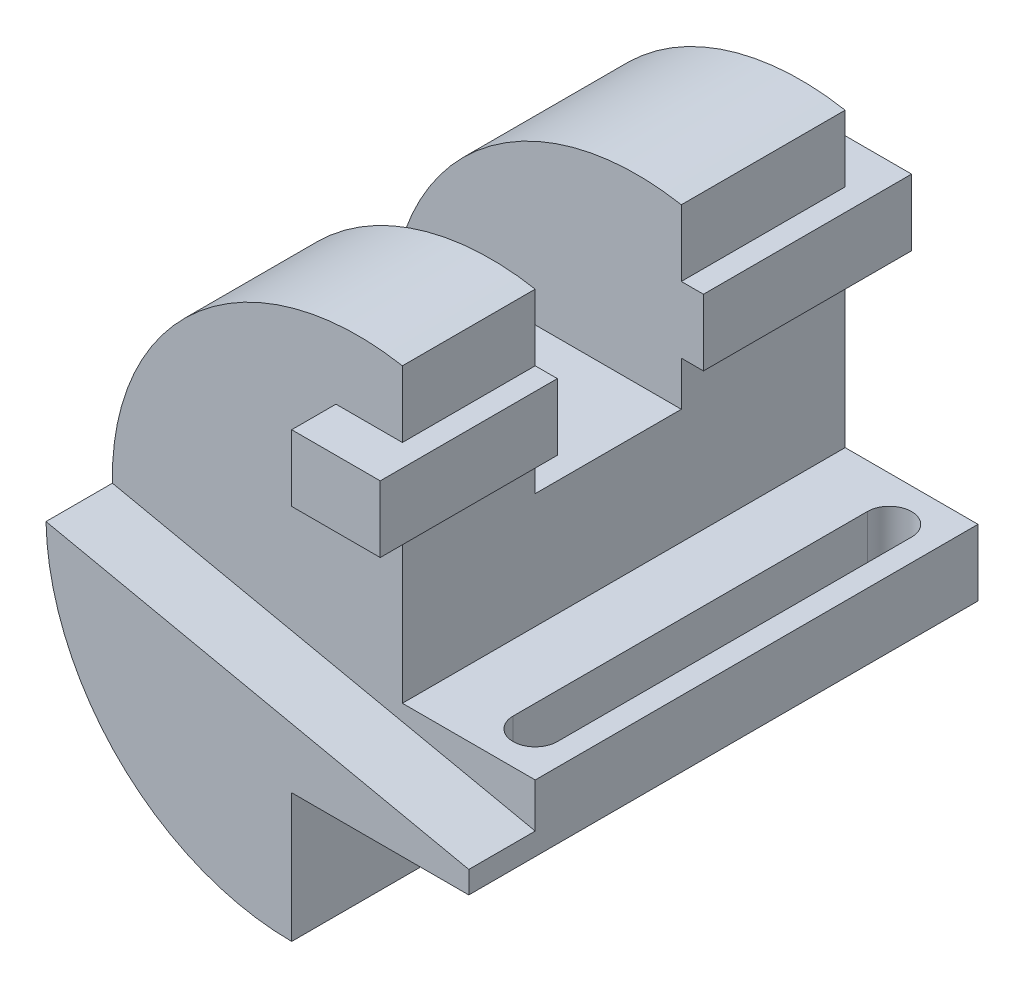
ISO-10303-21;
HEADER;
FILE_DESCRIPTION(('STEP AP214'),'2;1');
FILE_NAME('part.step','',(''),(''),'','','');
FILE_SCHEMA(('AUTOMOTIVE_DESIGN { 1 0 10303 214 1 1 1 1 }'));
ENDSEC;
DATA;
#1=APPLICATION_CONTEXT('core data for automotive mechanical design processes');
#2=APPLICATION_PROTOCOL_DEFINITION('international standard','automotive_design',2000,#1);
#3=PRODUCT_CONTEXT('',#1,'mechanical');
#4=PRODUCT('Part','Part','',(#3));
#5=PRODUCT_RELATED_PRODUCT_CATEGORY('part','',(#4));
#6=PRODUCT_DEFINITION_FORMATION('','',#4);
#7=PRODUCT_DEFINITION_CONTEXT('part definition',#1,'design');
#8=PRODUCT_DEFINITION('design','',#6,#7);
#9=PRODUCT_DEFINITION_SHAPE('','',#8);
#10=(LENGTH_UNIT() NAMED_UNIT(*) SI_UNIT(.MILLI.,.METRE.));
#11=(NAMED_UNIT(*) PLANE_ANGLE_UNIT() SI_UNIT($,.RADIAN.));
#12=(NAMED_UNIT(*) SI_UNIT($,.STERADIAN.) SOLID_ANGLE_UNIT());
#13=UNCERTAINTY_MEASURE_WITH_UNIT(LENGTH_MEASURE(1.E-05),#10,'distance_accuracy_value','');
#14=(GEOMETRIC_REPRESENTATION_CONTEXT(3) GLOBAL_UNCERTAINTY_ASSIGNED_CONTEXT((#13)) GLOBAL_UNIT_ASSIGNED_CONTEXT((#10,
#11,#12)) REPRESENTATION_CONTEXT('',''));
#15=CARTESIAN_POINT('',(0.,0.,0.));
#16=DIRECTION('',(0.,0.,1.));
#17=DIRECTION('',(1.,0.,0.));
#18=AXIS2_PLACEMENT_3D('',#15,#16,#17);
#19=CARTESIAN_POINT('',(-30.,15.,115.));
#20=DIRECTION('',(-1.,0.,0.));
#21=DIRECTION('',(0.,0.,1.));
#22=AXIS2_PLACEMENT_3D('',#19,#20,#21);
#23=PLANE('',#22);
#24=DIRECTION('',(0.,0.,1.));
#25=VECTOR('',#24,1.);
#26=CARTESIAN_POINT('',(-30.,66.,115.));
#27=LINE('',#26,#25);
#28=CARTESIAN_POINT('',(-30.,66.,70.));
#29=VERTEX_POINT('',#28);
#30=CARTESIAN_POINT('',(-30.,66.,100.));
#31=VERTEX_POINT('',#30);
#32=EDGE_CURVE('E322',#29,#31,#27,.T.);
#33=ORIENTED_EDGE('',*,*,#32,.F.);
#34=DIRECTION('',(0.,1.,0.));
#35=VECTOR('',#34,1.);
#36=CARTESIAN_POINT('',(-30.,15.,70.));
#37=LINE('',#36,#35);
#38=CARTESIAN_POINT('',(-30.,81.,70.));
#39=VERTEX_POINT('',#38);
#40=EDGE_CURVE('E271',#29,#39,#37,.T.);
#41=ORIENTED_EDGE('',*,*,#40,.T.);
#42=DIRECTION('',(0.,0.,-1.));
#43=VECTOR('',#42,1.);
#44=CARTESIAN_POINT('',(-30.,81.,115.));
#45=LINE('',#44,#43);
#46=CARTESIAN_POINT('',(-30.,81.,100.));
#47=VERTEX_POINT('',#46);
#48=EDGE_CURVE('E394',#47,#39,#45,.T.);
#49=ORIENTED_EDGE('',*,*,#48,.F.);
#50=DIRECTION('',(0.,1.,0.));
#51=VECTOR('',#50,1.);
#52=CARTESIAN_POINT('',(-30.,15.,100.));
#53=LINE('',#52,#51);
#54=EDGE_CURVE('E344',#31,#47,#53,.T.);
#55=ORIENTED_EDGE('',*,*,#54,.F.);
#56=EDGE_LOOP('',(#33,#41,#49,#55));
#57=FACE_BOUND('',#56,.T.);
#58=ADVANCED_FACE('F45',(#57),#23,.F.);
#59=CARTESIAN_POINT('',(-25.,66.,-10.));
#60=DIRECTION('',(-1.,0.,0.));
#61=DIRECTION('',(0.,0.,1.));
#62=AXIS2_PLACEMENT_3D('',#59,#60,#61);
#63=PLANE('',#62);
#64=DIRECTION('',(0.,0.,1.));
#65=VECTOR('',#64,1.);
#66=CARTESIAN_POINT('',(-25.,51.,-10.));
#67=LINE('',#66,#65);
#68=CARTESIAN_POINT('',(-25.,51.,70.));
#69=VERTEX_POINT('',#68);
#70=CARTESIAN_POINT('',(-25.,51.,110.));
#71=VERTEX_POINT('',#70);
#72=EDGE_CURVE('E318',#69,#71,#67,.T.);
#73=ORIENTED_EDGE('',*,*,#72,.F.);
#74=DIRECTION('',(0.,1.,0.));
#75=VECTOR('',#74,1.);
#76=CARTESIAN_POINT('',(-25.,66.,70.));
#77=LINE('',#76,#75);
#78=CARTESIAN_POINT('',(-25.,66.,70.));
#79=VERTEX_POINT('',#78);
#80=EDGE_CURVE('E266',#69,#79,#77,.T.);
#81=ORIENTED_EDGE('',*,*,#80,.T.);
#82=DIRECTION('',(0.,0.,1.));
#83=VECTOR('',#82,1.);
#84=CARTESIAN_POINT('',(-25.,66.,-10.));
#85=LINE('',#84,#83);
#86=CARTESIAN_POINT('',(-25.,66.,110.));
#87=VERTEX_POINT('',#86);
#88=EDGE_CURVE('E306',#79,#87,#85,.T.);
#89=ORIENTED_EDGE('',*,*,#88,.T.);
#90=DIRECTION('',(0.,1.,0.));
#91=VECTOR('',#90,1.);
#92=CARTESIAN_POINT('',(-25.,66.,110.));
#93=LINE('',#92,#91);
#94=EDGE_CURVE('E291',#71,#87,#93,.T.);
#95=ORIENTED_EDGE('',*,*,#94,.F.);
#96=EDGE_LOOP('',(#73,#81,#89,#95));
#97=FACE_BOUND('',#96,.T.);
#98=ADVANCED_FACE('F447',(#97),#63,.F.);
#99=CARTESIAN_POINT('',(-25.,51.,-10.));
#100=DIRECTION('',(0.,1.,0.));
#101=DIRECTION('',(0.,0.,1.));
#102=AXIS2_PLACEMENT_3D('',#99,#100,#101);
#103=PLANE('',#102);
#104=DIRECTION('',(0.,0.,-1.));
#105=VECTOR('',#104,1.);
#106=CARTESIAN_POINT('',(-30.,51.,115.));
#107=LINE('',#106,#105);
#108=CARTESIAN_POINT('',(-30.,51.,100.));
#109=VERTEX_POINT('',#108);
#110=CARTESIAN_POINT('',(-30.,51.,70.));
#111=VERTEX_POINT('',#110);
#112=EDGE_CURVE('E333',#109,#111,#107,.T.);
#113=ORIENTED_EDGE('',*,*,#112,.T.);
#114=DIRECTION('',(1.,0.,0.));
#115=VECTOR('',#114,1.);
#116=CARTESIAN_POINT('',(-25.,51.,70.));
#117=LINE('',#116,#115);
#118=EDGE_CURVE('E274',#111,#69,#117,.T.);
#119=ORIENTED_EDGE('',*,*,#118,.T.);
#120=ORIENTED_EDGE('',*,*,#72,.T.);
#121=DIRECTION('',(1.,0.,0.));
#122=VECTOR('',#121,1.);
#123=CARTESIAN_POINT('',(-25.,51.,110.));
#124=LINE('',#123,#122);
#125=CARTESIAN_POINT('',(-45.,51.,110.));
#126=VERTEX_POINT('',#125);
#127=EDGE_CURVE('E294',#126,#71,#124,.T.);
#128=ORIENTED_EDGE('',*,*,#127,.F.);
#129=DIRECTION('',(0.,0.,1.));
#130=VECTOR('',#129,1.);
#131=CARTESIAN_POINT('',(-45.,51.,-10.));
#132=LINE('',#131,#130);
#133=CARTESIAN_POINT('',(-45.,51.,100.));
#134=VERTEX_POINT('',#133);
#135=EDGE_CURVE('E314',#134,#126,#132,.T.);
#136=ORIENTED_EDGE('',*,*,#135,.F.);
#137=DIRECTION('',(-1.,0.,0.));
#138=VECTOR('',#137,1.);
#139=CARTESIAN_POINT('',(-40.,51.,100.));
#140=LINE('',#139,#138);
#141=EDGE_CURVE('E407',#109,#134,#140,.T.);
#142=ORIENTED_EDGE('',*,*,#141,.F.);
#143=EDGE_LOOP('',(#113,#119,#120,#128,#136,#142));
#144=FACE_BOUND('',#143,.T.);
#145=ADVANCED_FACE('F456',(#144),#103,.F.);
#146=CARTESIAN_POINT('',(-25.,66.,-10.));
#147=DIRECTION('',(0.,-1.,0.));
#148=DIRECTION('',(0.,0.,-1.));
#149=AXIS2_PLACEMENT_3D('',#146,#147,#148);
#150=PLANE('',#149);
#151=ORIENTED_EDGE('',*,*,#88,.F.);
#152=DIRECTION('',(-1.,0.,0.));
#153=VECTOR('',#152,1.);
#154=CARTESIAN_POINT('',(-25.,66.,70.));
#155=LINE('',#154,#153);
#156=EDGE_CURVE('E413',#79,#29,#155,.T.);
#157=ORIENTED_EDGE('',*,*,#156,.T.);
#158=ORIENTED_EDGE('',*,*,#32,.T.);
#159=DIRECTION('',(1.,0.,0.));
#160=VECTOR('',#159,1.);
#161=CARTESIAN_POINT('',(-40.,66.,100.));
#162=LINE('',#161,#160);
#163=CARTESIAN_POINT('',(-45.,66.,100.));
#164=VERTEX_POINT('',#163);
#165=EDGE_CURVE('E401',#164,#31,#162,.T.);
#166=ORIENTED_EDGE('',*,*,#165,.F.);
#167=DIRECTION('',(0.,0.,1.));
#168=VECTOR('',#167,1.);
#169=CARTESIAN_POINT('',(-45.,66.,-10.));
#170=LINE('',#169,#168);
#171=CARTESIAN_POINT('',(-45.,66.,110.));
#172=VERTEX_POINT('',#171);
#173=EDGE_CURVE('E310',#164,#172,#170,.T.);
#174=ORIENTED_EDGE('',*,*,#173,.T.);
#175=DIRECTION('',(-1.,0.,0.));
#176=VECTOR('',#175,1.);
#177=CARTESIAN_POINT('',(-25.,66.,110.));
#178=LINE('',#177,#176);
#179=EDGE_CURVE('E288',#87,#172,#178,.T.);
#180=ORIENTED_EDGE('',*,*,#179,.F.);
#181=EDGE_LOOP('',(#151,#157,#158,#166,#174,#180));
#182=FACE_BOUND('',#181,.T.);
#183=ADVANCED_FACE('F466',(#182),#150,.F.);
#184=DIRECTION('',(0.,0.,1.));
#185=VECTOR('',#184,1.);
#186=CARTESIAN_POINT('',(-30.,41.,115.));
#187=LINE('',#186,#185);
#188=CARTESIAN_POINT('',(-30.,41.,37.));
#189=VERTEX_POINT('',#188);
#190=CARTESIAN_POINT('',(-30.,41.,70.));
#191=VERTEX_POINT('',#190);
#192=EDGE_CURVE('E282',#189,#191,#187,.T.);
#193=ORIENTED_EDGE('',*,*,#192,.T.);
#194=DIRECTION('',(0.,1.,0.));
#195=VECTOR('',#194,1.);
#196=CARTESIAN_POINT('',(-30.,15.,70.));
#197=LINE('',#196,#195);
#198=EDGE_CURVE('E279',#191,#111,#197,.T.);
#199=ORIENTED_EDGE('',*,*,#198,.T.);
#200=ORIENTED_EDGE('',*,*,#112,.F.);
#201=CARTESIAN_POINT('',(-30.,15.,100.));
#202=VERTEX_POINT('',#201);
#203=EDGE_CURVE('E345',#202,#109,#53,.T.);
#204=ORIENTED_EDGE('',*,*,#203,.F.);
#205=DIRECTION('',(0.,0.,-1.));
#206=VECTOR('',#205,1.);
#207=CARTESIAN_POINT('',(-30.,15.,115.));
#208=LINE('',#207,#206);
#209=CARTESIAN_POINT('',(-30.,15.,0.));
#210=VERTEX_POINT('',#209);
#211=EDGE_CURVE('E397',#202,#210,#208,.T.);
#212=ORIENTED_EDGE('',*,*,#211,.T.);
#213=DIRECTION('',(0.,1.,0.));
#214=VECTOR('',#213,1.);
#215=CARTESIAN_POINT('',(-30.,15.,0.));
#216=LINE('',#215,#214);
#217=CARTESIAN_POINT('',(-30.,51.,0.));
#218=VERTEX_POINT('',#217);
#219=EDGE_CURVE('E377',#210,#218,#216,.T.);
#220=ORIENTED_EDGE('',*,*,#219,.T.);
#221=CARTESIAN_POINT('',(-30.,51.,37.));
#222=VERTEX_POINT('',#221);
#223=EDGE_CURVE('E332',#222,#218,#107,.T.);
#224=ORIENTED_EDGE('',*,*,#223,.F.);
#225=DIRECTION('',(0.,-1.,0.));
#226=VECTOR('',#225,1.);
#227=CARTESIAN_POINT('',(-30.,15.,37.));
#228=LINE('',#227,#226);
#229=EDGE_CURVE('E263',#222,#189,#228,.T.);
#230=ORIENTED_EDGE('',*,*,#229,.T.);
#231=EDGE_LOOP('',(#193,#199,#200,#204,#212,#220,#224,#230));
#232=FACE_BOUND('',#231,.T.);
#233=ADVANCED_FACE('F451',(#232),#23,.F.);
#234=CARTESIAN_POINT('',(-30.,81.,37.));
#235=VERTEX_POINT('',#234);
#236=CARTESIAN_POINT('',(-30.,81.,0.));
#237=VERTEX_POINT('',#236);
#238=EDGE_CURVE('E393',#235,#237,#45,.T.);
#239=ORIENTED_EDGE('',*,*,#238,.F.);
#240=DIRECTION('',(0.,-1.,0.));
#241=VECTOR('',#240,1.);
#242=CARTESIAN_POINT('',(-30.,15.,37.));
#243=LINE('',#242,#241);
#244=CARTESIAN_POINT('',(-30.,66.,37.));
#245=VERTEX_POINT('',#244);
#246=EDGE_CURVE('E257',#235,#245,#243,.T.);
#247=ORIENTED_EDGE('',*,*,#246,.T.);
#248=CARTESIAN_POINT('',(-30.,66.,0.));
#249=VERTEX_POINT('',#248);
#250=EDGE_CURVE('E323',#249,#245,#27,.T.);
#251=ORIENTED_EDGE('',*,*,#250,.F.);
#252=EDGE_CURVE('E376',#249,#237,#216,.T.);
#253=ORIENTED_EDGE('',*,*,#252,.T.);
#254=EDGE_LOOP('',(#239,#247,#251,#253));
#255=FACE_BOUND('',#254,.T.);
#256=ADVANCED_FACE('F450',(#255),#23,.F.);
#257=CARTESIAN_POINT('',(-40.,26.4083339693685,0.));
#258=DIRECTION('',(0.,0.,-1.));
#259=DIRECTION('',(-1.,0.,0.));
#260=AXIS2_PLACEMENT_3D('',#257,#258,#259);
#261=PLANE('',#260);
#262=DIRECTION('',(0.,-1.,0.));
#263=VECTOR('',#262,1.);
#264=CARTESIAN_POINT('',(-45.,26.4083339693685,0.));
#265=LINE('',#264,#263);
#266=CARTESIAN_POINT('',(-45.,66.,0.));
#267=VERTEX_POINT('',#266);
#268=CARTESIAN_POINT('',(-45.,51.,0.));
#269=VERTEX_POINT('',#268);
#270=EDGE_CURVE('E329',#267,#269,#265,.T.);
#271=ORIENTED_EDGE('',*,*,#270,.T.);
#272=DIRECTION('',(1.,0.,0.));
#273=VECTOR('',#272,1.);
#274=CARTESIAN_POINT('',(-40.,51.,0.));
#275=LINE('',#274,#273);
#276=EDGE_CURVE('E336',#269,#218,#275,.T.);
#277=ORIENTED_EDGE('',*,*,#276,.T.);
#278=ORIENTED_EDGE('',*,*,#219,.F.);
#279=DIRECTION('',(-1.,0.,0.));
#280=VECTOR('',#279,1.);
#281=CARTESIAN_POINT('',(0.,15.,0.));
#282=LINE('',#281,#280);
#283=CARTESIAN_POINT('',(0.,15.,0.));
#284=VERTEX_POINT('',#283);
#285=EDGE_CURVE('E373',#284,#210,#282,.T.);
#286=ORIENTED_EDGE('',*,*,#285,.F.);
#287=DIRECTION('',(0.,1.,0.));
#288=VECTOR('',#287,1.);
#289=CARTESIAN_POINT('',(0.,0.,0.));
#290=LINE('',#289,#288);
#291=CARTESIAN_POINT('',(0.,0.,0.));
#292=VERTEX_POINT('',#291);
#293=EDGE_CURVE('E358',#292,#284,#290,.T.);
#294=ORIENTED_EDGE('',*,*,#293,.F.);
#295=DIRECTION('',(1.,0.,0.));
#296=VECTOR('',#295,1.);
#297=CARTESIAN_POINT('',(0.,0.,0.));
#298=LINE('',#297,#296);
#299=CARTESIAN_POINT('',(-40.,0.,0.));
#300=VERTEX_POINT('',#299);
#301=EDGE_CURVE('E364',#300,#292,#298,.T.);
#302=ORIENTED_EDGE('',*,*,#301,.F.);
#303=DIRECTION('',(0.,1.,0.));
#304=VECTOR('',#303,1.);
#305=CARTESIAN_POINT('',(-40.,0.,0.));
#306=LINE('',#305,#304);
#307=CARTESIAN_POINT('',(-40.,-29.0916660306315,0.));
#308=VERTEX_POINT('',#307);
#309=EDGE_CURVE('E382',#308,#300,#306,.T.);
#310=ORIENTED_EDGE('',*,*,#309,.F.);
#311=CARTESIAN_POINT('',(-40.,26.4083339693685,0.));
#312=DIRECTION('',(0.,0.,1.));
#313=DIRECTION('',(-1.,0.,0.));
#314=AXIS2_PLACEMENT_3D('',#311,#312,#313);
#315=CIRCLE('',#314,55.5);
#316=EDGE_CURVE('E380',#237,#308,#315,.T.);
#317=ORIENTED_EDGE('',*,*,#316,.F.);
#318=ORIENTED_EDGE('',*,*,#252,.F.);
#319=DIRECTION('',(-1.,0.,0.));
#320=VECTOR('',#319,1.);
#321=CARTESIAN_POINT('',(-40.,66.,0.));
#322=LINE('',#321,#320);
#323=EDGE_CURVE('E326',#249,#267,#322,.T.);
#324=ORIENTED_EDGE('',*,*,#323,.T.);
#325=EDGE_LOOP('',(#271,#277,#278,#286,#294,#302,#310,#317,#318,#324));
#326=FACE_BOUND('',#325,.T.);
#327=ADVANCED_FACE('F463',(#326),#261,.T.);
#328=CARTESIAN_POINT('',(-40.,26.4083339693685,100.));
#329=DIRECTION('',(0.,0.,1.));
#330=DIRECTION('',(1.,0.,0.));
#331=AXIS2_PLACEMENT_3D('',#328,#329,#330);
#332=PLANE('',#331);
#333=ORIENTED_EDGE('',*,*,#203,.T.);
#334=ORIENTED_EDGE('',*,*,#141,.T.);
#335=DIRECTION('',(0.,1.,0.));
#336=VECTOR('',#335,1.);
#337=CARTESIAN_POINT('',(-45.,26.4083339693685,100.));
#338=LINE('',#337,#336);
#339=EDGE_CURVE('E404',#134,#164,#338,.T.);
#340=ORIENTED_EDGE('',*,*,#339,.T.);
#341=ORIENTED_EDGE('',*,*,#165,.T.);
#342=ORIENTED_EDGE('',*,*,#54,.T.);
#343=CARTESIAN_POINT('',(-40.,26.4083339693685,100.));
#344=DIRECTION('',(0.,0.,1.));
#345=DIRECTION('',(1.,0.,0.));
#346=AXIS2_PLACEMENT_3D('',#343,#344,#345);
#347=CIRCLE('',#346,55.5);
#348=CARTESIAN_POINT('',(-95.4888678913132,25.2967854367402,100.));
#349=VERTEX_POINT('',#348);
#350=EDGE_CURVE('E348',#47,#349,#347,.T.);
#351=ORIENTED_EDGE('',*,*,#350,.T.);
#352=DIRECTION('',(0.978147600733806,-0.207911690817756,0.));
#353=VECTOR('',#352,1.);
#354=CARTESIAN_POINT('',(0.,5.,100.));
#355=LINE('',#354,#353);
#356=CARTESIAN_POINT('',(0.,5.,100.));
#357=VERTEX_POINT('',#356);
#358=EDGE_CURVE('E350',#349,#357,#355,.T.);
#359=ORIENTED_EDGE('',*,*,#358,.T.);
#360=DIRECTION('',(0.,1.,0.));
#361=VECTOR('',#360,1.);
#362=CARTESIAN_POINT('',(0.,5.,100.));
#363=LINE('',#362,#361);
#364=CARTESIAN_POINT('',(0.,15.,100.));
#365=VERTEX_POINT('',#364);
#366=EDGE_CURVE('E340',#357,#365,#363,.T.);
#367=ORIENTED_EDGE('',*,*,#366,.T.);
#368=DIRECTION('',(-1.,0.,0.));
#369=VECTOR('',#368,1.);
#370=CARTESIAN_POINT('',(0.,15.,100.));
#371=LINE('',#370,#369);
#372=EDGE_CURVE('E342',#365,#202,#371,.T.);
#373=ORIENTED_EDGE('',*,*,#372,.T.);
#374=EDGE_LOOP('',(#333,#334,#340,#341,#342,#351,#359,#367,#373));
#375=FACE_BOUND('',#374,.T.);
#376=ADVANCED_FACE('F501',(#375),#332,.T.);
#377=CARTESIAN_POINT('',(0.,15.,115.));
#378=DIRECTION('',(0.,-1.,0.));
#379=DIRECTION('',(1.,0.,0.));
#380=AXIS2_PLACEMENT_3D('',#377,#378,#379);
#381=PLANE('',#380);
#382=DIRECTION('',(0.,0.,-1.));
#383=VECTOR('',#382,1.);
#384=CARTESIAN_POINT('',(-15.,15.,115.));
#385=LINE('',#384,#383);
#386=CARTESIAN_POINT('',(-15.,15.,90.));
#387=VERTEX_POINT('',#386);
#388=CARTESIAN_POINT('',(-15.,15.,10.));
#389=VERTEX_POINT('',#388);
#390=EDGE_CURVE('E221',#387,#389,#385,.T.);
#391=ORIENTED_EDGE('',*,*,#390,.T.);
#392=CARTESIAN_POINT('',(-10.,15.,10.));
#393=DIRECTION('',(0.,-1.,0.));
#394=DIRECTION('',(1.,0.,0.));
#395=AXIS2_PLACEMENT_3D('',#392,#393,#394);
#396=CIRCLE('',#395,5.);
#397=CARTESIAN_POINT('',(-5.,15.,10.));
#398=VERTEX_POINT('',#397);
#399=EDGE_CURVE('E243',#389,#398,#396,.T.);
#400=ORIENTED_EDGE('',*,*,#399,.T.);
#401=DIRECTION('',(0.,0.,1.));
#402=VECTOR('',#401,1.);
#403=CARTESIAN_POINT('',(-5.,15.,115.));
#404=LINE('',#403,#402);
#405=CARTESIAN_POINT('',(-5.,15.,90.));
#406=VERTEX_POINT('',#405);
#407=EDGE_CURVE('E241',#398,#406,#404,.T.);
#408=ORIENTED_EDGE('',*,*,#407,.T.);
#409=CARTESIAN_POINT('',(-10.,15.,90.));
#410=DIRECTION('',(0.,-1.,0.));
#411=DIRECTION('',(1.,0.,0.));
#412=AXIS2_PLACEMENT_3D('',#409,#410,#411);
#413=CIRCLE('',#412,5.);
#414=EDGE_CURVE('E226',#406,#387,#413,.T.);
#415=ORIENTED_EDGE('',*,*,#414,.T.);
#416=EDGE_LOOP('',(#391,#400,#408,#415));
#417=FACE_BOUND('',#416,.T.);
#418=ORIENTED_EDGE('',*,*,#372,.F.);
#419=DIRECTION('',(0.,0.,-1.));
#420=VECTOR('',#419,1.);
#421=CARTESIAN_POINT('',(0.,15.,115.));
#422=LINE('',#421,#420);
#423=EDGE_CURVE('E399',#365,#284,#422,.T.);
#424=ORIENTED_EDGE('',*,*,#423,.T.);
#425=ORIENTED_EDGE('',*,*,#285,.T.);
#426=ORIENTED_EDGE('',*,*,#211,.F.);
#427=EDGE_LOOP('',(#418,#424,#425,#426));
#428=FACE_BOUND('',#427,.T.);
#429=ADVANCED_FACE('F239',(#417,#428),#381,.F.);
#430=CARTESIAN_POINT('',(0.,0.,115.));
#431=DIRECTION('',(-1.,0.,0.));
#432=DIRECTION('',(0.,0.,1.));
#433=AXIS2_PLACEMENT_3D('',#430,#431,#432);
#434=PLANE('',#433);
#435=ORIENTED_EDGE('',*,*,#366,.F.);
#436=DIRECTION('',(0.,0.,1.));
#437=VECTOR('',#436,1.);
#438=CARTESIAN_POINT('',(0.,5.,100.));
#439=LINE('',#438,#437);
#440=CARTESIAN_POINT('',(0.,5.,115.));
#441=VERTEX_POINT('',#440);
#442=EDGE_CURVE('E355',#357,#441,#439,.T.);
#443=ORIENTED_EDGE('',*,*,#442,.T.);
#444=DIRECTION('',(0.,1.,0.));
#445=VECTOR('',#444,1.);
#446=CARTESIAN_POINT('',(0.,0.,115.));
#447=LINE('',#446,#445);
#448=CARTESIAN_POINT('',(0.,0.,115.));
#449=VERTEX_POINT('',#448);
#450=EDGE_CURVE('E360',#449,#441,#447,.T.);
#451=ORIENTED_EDGE('',*,*,#450,.F.);
#452=DIRECTION('',(0.,0.,-1.));
#453=VECTOR('',#452,1.);
#454=CARTESIAN_POINT('',(0.,0.,115.));
#455=LINE('',#454,#453);
#456=EDGE_CURVE('E370',#449,#292,#455,.T.);
#457=ORIENTED_EDGE('',*,*,#456,.T.);
#458=ORIENTED_EDGE('',*,*,#293,.T.);
#459=ORIENTED_EDGE('',*,*,#423,.F.);
#460=EDGE_LOOP('',(#435,#443,#451,#457,#458,#459));
#461=FACE_BOUND('',#460,.T.);
#462=ADVANCED_FACE('F47',(#461),#434,.F.);
#463=CARTESIAN_POINT('',(-40.,26.4083339693685,115.));
#464=DIRECTION('',(0.,0.,-1.));
#465=DIRECTION('',(-1.,0.,0.));
#466=AXIS2_PLACEMENT_3D('',#463,#464,#465);
#467=CYLINDRICAL_SURFACE('',#466,55.5);
#468=ORIENTED_EDGE('',*,*,#48,.T.);
#469=CARTESIAN_POINT('',(-40.,26.4083339693685,70.));
#470=DIRECTION('',(0.,0.,1.));
#471=DIRECTION('',(1.,0.,0.));
#472=AXIS2_PLACEMENT_3D('',#469,#470,#471);
#473=CIRCLE('',#472,55.5);
#474=CARTESIAN_POINT('',(-93.5474862383895,41.,70.));
#475=VERTEX_POINT('',#474);
#476=EDGE_CURVE('E277',#39,#475,#473,.T.);
#477=ORIENTED_EDGE('',*,*,#476,.T.);
#478=DIRECTION('',(0.,0.,-1.));
#479=VECTOR('',#478,1.);
#480=CARTESIAN_POINT('',(-93.5474862383895,41.,115.));
#481=LINE('',#480,#479);
#482=CARTESIAN_POINT('',(-93.5474862383895,41.,37.));
#483=VERTEX_POINT('',#482);
#484=EDGE_CURVE('E416',#475,#483,#481,.T.);
#485=ORIENTED_EDGE('',*,*,#484,.T.);
#486=CARTESIAN_POINT('',(-40.,26.4083339693685,37.));
#487=DIRECTION('',(0.,0.,-1.));
#488=DIRECTION('',(0.,1.,0.));
#489=AXIS2_PLACEMENT_3D('',#486,#487,#488);
#490=CIRCLE('',#489,55.5);
#491=EDGE_CURVE('E264',#483,#235,#490,.T.);
#492=ORIENTED_EDGE('',*,*,#491,.T.);
#493=ORIENTED_EDGE('',*,*,#238,.T.);
#494=ORIENTED_EDGE('',*,*,#316,.T.);
#495=DIRECTION('',(0.,0.,-1.));
#496=VECTOR('',#495,1.);
#497=CARTESIAN_POINT('',(-40.,-29.0916660306315,115.));
#498=LINE('',#497,#496);
#499=CARTESIAN_POINT('',(-40.,-29.0916660306315,115.));
#500=VERTEX_POINT('',#499);
#501=EDGE_CURVE('E390',#500,#308,#498,.T.);
#502=ORIENTED_EDGE('',*,*,#501,.F.);
#503=CARTESIAN_POINT('',(-40.,26.4083339693685,115.));
#504=DIRECTION('',(0.,0.,1.));
#505=DIRECTION('',(-1.,0.,0.));
#506=AXIS2_PLACEMENT_3D('',#503,#504,#505);
#507=CIRCLE('',#506,55.5);
#508=CARTESIAN_POINT('',(-95.4888678913132,25.2967854367402,115.));
#509=VERTEX_POINT('',#508);
#510=EDGE_CURVE('E363',#509,#500,#507,.T.);
#511=ORIENTED_EDGE('',*,*,#510,.F.);
#512=DIRECTION('',(0.,0.,1.));
#513=VECTOR('',#512,1.);
#514=CARTESIAN_POINT('',(-95.4888678913132,25.2967854367402,100.));
#515=LINE('',#514,#513);
#516=EDGE_CURVE('E353',#349,#509,#515,.T.);
#517=ORIENTED_EDGE('',*,*,#516,.F.);
#518=ORIENTED_EDGE('',*,*,#350,.F.);
#519=EDGE_LOOP('',(#468,#477,#485,#492,#493,#494,#502,#511,#517,#518));
#520=FACE_BOUND('',#519,.T.);
#521=ADVANCED_FACE('F484',(#520),#467,.T.);
#522=CARTESIAN_POINT('',(-40.,0.,115.));
#523=DIRECTION('',(-1.,0.,0.));
#524=DIRECTION('',(0.,-1.,0.));
#525=AXIS2_PLACEMENT_3D('',#522,#523,#524);
#526=PLANE('',#525);
#527=ORIENTED_EDGE('',*,*,#309,.T.);
#528=DIRECTION('',(0.,0.,-1.));
#529=VECTOR('',#528,1.);
#530=CARTESIAN_POINT('',(-40.,0.,115.));
#531=LINE('',#530,#529);
#532=CARTESIAN_POINT('',(-40.,0.,115.));
#533=VERTEX_POINT('',#532);
#534=EDGE_CURVE('E387',#533,#300,#531,.T.);
#535=ORIENTED_EDGE('',*,*,#534,.F.);
#536=DIRECTION('',(0.,1.,0.));
#537=VECTOR('',#536,1.);
#538=CARTESIAN_POINT('',(-40.,0.,115.));
#539=LINE('',#538,#537);
#540=EDGE_CURVE('E366',#500,#533,#539,.T.);
#541=ORIENTED_EDGE('',*,*,#540,.F.);
#542=ORIENTED_EDGE('',*,*,#501,.T.);
#543=EDGE_LOOP('',(#527,#535,#541,#542));
#544=FACE_BOUND('',#543,.T.);
#545=ADVANCED_FACE('F529',(#544),#526,.F.);
#546=CARTESIAN_POINT('',(0.,0.,115.));
#547=DIRECTION('',(0.,1.,0.));
#548=DIRECTION('',(-1.,0.,0.));
#549=AXIS2_PLACEMENT_3D('',#546,#547,#548);
#550=PLANE('',#549);
#551=DIRECTION('',(0.,0.,-1.));
#552=VECTOR('',#551,1.);
#553=CARTESIAN_POINT('',(-5.,0.,115.));
#554=LINE('',#553,#552);
#555=CARTESIAN_POINT('',(-5.,0.,90.));
#556=VERTEX_POINT('',#555);
#557=CARTESIAN_POINT('',(-5.,0.,10.));
#558=VERTEX_POINT('',#557);
#559=EDGE_CURVE('E53',#556,#558,#554,.T.);
#560=ORIENTED_EDGE('',*,*,#559,.T.);
#561=CARTESIAN_POINT('',(-10.,0.,10.));
#562=DIRECTION('',(0.,1.,0.));
#563=DIRECTION('',(-1.,0.,0.));
#564=AXIS2_PLACEMENT_3D('',#561,#562,#563);
#565=CIRCLE('',#564,5.);
#566=CARTESIAN_POINT('',(-15.,0.,10.));
#567=VERTEX_POINT('',#566);
#568=EDGE_CURVE('E12',#558,#567,#565,.T.);
#569=ORIENTED_EDGE('',*,*,#568,.T.);
#570=DIRECTION('',(0.,0.,1.));
#571=VECTOR('',#570,1.);
#572=CARTESIAN_POINT('',(-15.,0.,115.));
#573=LINE('',#572,#571);
#574=CARTESIAN_POINT('',(-15.,0.,90.));
#575=VERTEX_POINT('',#574);
#576=EDGE_CURVE('E419',#567,#575,#573,.T.);
#577=ORIENTED_EDGE('',*,*,#576,.T.);
#578=CARTESIAN_POINT('',(-10.,0.,90.));
#579=DIRECTION('',(0.,1.,0.));
#580=DIRECTION('',(-1.,0.,0.));
#581=AXIS2_PLACEMENT_3D('',#578,#579,#580);
#582=CIRCLE('',#581,5.);
#583=EDGE_CURVE('E234',#575,#556,#582,.T.);
#584=ORIENTED_EDGE('',*,*,#583,.T.);
#585=EDGE_LOOP('',(#560,#569,#577,#584));
#586=FACE_BOUND('',#585,.T.);
#587=ORIENTED_EDGE('',*,*,#301,.T.);
#588=ORIENTED_EDGE('',*,*,#456,.F.);
#589=DIRECTION('',(1.,0.,0.));
#590=VECTOR('',#589,1.);
#591=CARTESIAN_POINT('',(0.,0.,115.));
#592=LINE('',#591,#590);
#593=EDGE_CURVE('E368',#533,#449,#592,.T.);
#594=ORIENTED_EDGE('',*,*,#593,.F.);
#595=ORIENTED_EDGE('',*,*,#534,.T.);
#596=EDGE_LOOP('',(#587,#588,#594,#595));
#597=FACE_BOUND('',#596,.T.);
#598=ADVANCED_FACE('F423',(#586,#597),#550,.F.);
#599=CARTESIAN_POINT('',(-40.,26.4083339693685,115.));
#600=DIRECTION('',(0.,0.,-1.));
#601=DIRECTION('',(-1.,0.,0.));
#602=AXIS2_PLACEMENT_3D('',#599,#600,#601);
#603=PLANE('',#602);
#604=ORIENTED_EDGE('',*,*,#450,.T.);
#605=DIRECTION('',(0.978147600733806,-0.207911690817756,0.));
#606=VECTOR('',#605,1.);
#607=CARTESIAN_POINT('',(0.,5.,115.));
#608=LINE('',#607,#606);
#609=EDGE_CURVE('E339',#509,#441,#608,.T.);
#610=ORIENTED_EDGE('',*,*,#609,.F.);
#611=ORIENTED_EDGE('',*,*,#510,.T.);
#612=ORIENTED_EDGE('',*,*,#540,.T.);
#613=ORIENTED_EDGE('',*,*,#593,.T.);
#614=EDGE_LOOP('',(#604,#610,#611,#612,#613));
#615=FACE_BOUND('',#614,.T.);
#616=ADVANCED_FACE('F533',(#615),#603,.F.);
#617=CARTESIAN_POINT('',(0.,5.,100.));
#618=DIRECTION('',(-0.207911690817756,-0.978147600733806,0.));
#619=DIRECTION('',(0.978147600733806,-0.207911690817756,0.));
#620=AXIS2_PLACEMENT_3D('',#617,#618,#619);
#621=PLANE('',#620);
#622=ORIENTED_EDGE('',*,*,#609,.T.);
#623=ORIENTED_EDGE('',*,*,#442,.F.);
#624=ORIENTED_EDGE('',*,*,#358,.F.);
#625=ORIENTED_EDGE('',*,*,#516,.T.);
#626=EDGE_LOOP('',(#622,#623,#624,#625));
#627=FACE_BOUND('',#626,.T.);
#628=ADVANCED_FACE('F541',(#627),#621,.F.);
#629=CARTESIAN_POINT('',(-45.,66.,-10.));
#630=DIRECTION('',(1.,0.,0.));
#631=DIRECTION('',(0.,0.,-1.));
#632=AXIS2_PLACEMENT_3D('',#629,#630,#631);
#633=PLANE('',#632);
#634=ORIENTED_EDGE('',*,*,#270,.F.);
#635=CARTESIAN_POINT('',(-45.,66.,-10.));
#636=VERTEX_POINT('',#635);
#637=EDGE_CURVE('E311',#636,#267,#170,.T.);
#638=ORIENTED_EDGE('',*,*,#637,.F.);
#639=DIRECTION('',(0.,1.,0.));
#640=VECTOR('',#639,1.);
#641=CARTESIAN_POINT('',(-45.,66.,-10.));
#642=LINE('',#641,#640);
#643=CARTESIAN_POINT('',(-45.,51.,-10.));
#644=VERTEX_POINT('',#643);
#645=EDGE_CURVE('E302',#644,#636,#642,.T.);
#646=ORIENTED_EDGE('',*,*,#645,.F.);
#647=EDGE_CURVE('E315',#644,#269,#132,.T.);
#648=ORIENTED_EDGE('',*,*,#647,.T.);
#649=EDGE_LOOP('',(#634,#638,#646,#648));
#650=FACE_BOUND('',#649,.T.);
#651=ADVANCED_FACE('F572',(#650),#633,.F.);
#652=CARTESIAN_POINT('',(-25.,66.,-10.));
#653=VERTEX_POINT('',#652);
#654=CARTESIAN_POINT('',(-25.,66.,37.));
#655=VERTEX_POINT('',#654);
#656=EDGE_CURVE('E307',#653,#655,#85,.T.);
#657=ORIENTED_EDGE('',*,*,#656,.T.);
#658=DIRECTION('',(0.,-1.,0.));
#659=VECTOR('',#658,1.);
#660=CARTESIAN_POINT('',(-25.,66.,37.));
#661=LINE('',#660,#659);
#662=CARTESIAN_POINT('',(-25.,51.,37.));
#663=VERTEX_POINT('',#662);
#664=EDGE_CURVE('E252',#655,#663,#661,.T.);
#665=ORIENTED_EDGE('',*,*,#664,.T.);
#666=CARTESIAN_POINT('',(-25.,51.,-10.));
#667=VERTEX_POINT('',#666);
#668=EDGE_CURVE('E319',#667,#663,#67,.T.);
#669=ORIENTED_EDGE('',*,*,#668,.F.);
#670=DIRECTION('',(0.,-1.,0.));
#671=VECTOR('',#670,1.);
#672=CARTESIAN_POINT('',(-25.,66.,-10.));
#673=LINE('',#672,#671);
#674=EDGE_CURVE('E297',#653,#667,#673,.T.);
#675=ORIENTED_EDGE('',*,*,#674,.F.);
#676=EDGE_LOOP('',(#657,#665,#669,#675));
#677=FACE_BOUND('',#676,.T.);
#678=ADVANCED_FACE('F459',(#677),#63,.F.);
#679=ORIENTED_EDGE('',*,*,#668,.T.);
#680=DIRECTION('',(-1.,0.,0.));
#681=VECTOR('',#680,1.);
#682=CARTESIAN_POINT('',(-25.,51.,37.));
#683=LINE('',#682,#681);
#684=EDGE_CURVE('E260',#663,#222,#683,.T.);
#685=ORIENTED_EDGE('',*,*,#684,.T.);
#686=ORIENTED_EDGE('',*,*,#223,.T.);
#687=ORIENTED_EDGE('',*,*,#276,.F.);
#688=ORIENTED_EDGE('',*,*,#647,.F.);
#689=DIRECTION('',(-1.,0.,0.));
#690=VECTOR('',#689,1.);
#691=CARTESIAN_POINT('',(-25.,51.,-10.));
#692=LINE('',#691,#690);
#693=EDGE_CURVE('E300',#667,#644,#692,.T.);
#694=ORIENTED_EDGE('',*,*,#693,.F.);
#695=EDGE_LOOP('',(#679,#685,#686,#687,#688,#694));
#696=FACE_BOUND('',#695,.T.);
#697=ADVANCED_FACE('F512',(#696),#103,.F.);
#698=ORIENTED_EDGE('',*,*,#339,.F.);
#699=ORIENTED_EDGE('',*,*,#135,.T.);
#700=DIRECTION('',(0.,-1.,0.));
#701=VECTOR('',#700,1.);
#702=CARTESIAN_POINT('',(-45.,66.,110.));
#703=LINE('',#702,#701);
#704=EDGE_CURVE('E285',#172,#126,#703,.T.);
#705=ORIENTED_EDGE('',*,*,#704,.F.);
#706=ORIENTED_EDGE('',*,*,#173,.F.);
#707=EDGE_LOOP('',(#698,#699,#705,#706));
#708=FACE_BOUND('',#707,.T.);
#709=ADVANCED_FACE('F498',(#708),#633,.F.);
#710=ORIENTED_EDGE('',*,*,#250,.T.);
#711=DIRECTION('',(1.,0.,0.));
#712=VECTOR('',#711,1.);
#713=CARTESIAN_POINT('',(-25.,66.,37.));
#714=LINE('',#713,#712);
#715=EDGE_CURVE('E410',#245,#655,#714,.T.);
#716=ORIENTED_EDGE('',*,*,#715,.T.);
#717=ORIENTED_EDGE('',*,*,#656,.F.);
#718=DIRECTION('',(1.,0.,0.));
#719=VECTOR('',#718,1.);
#720=CARTESIAN_POINT('',(-25.,66.,-10.));
#721=LINE('',#720,#719);
#722=EDGE_CURVE('E304',#636,#653,#721,.T.);
#723=ORIENTED_EDGE('',*,*,#722,.F.);
#724=ORIENTED_EDGE('',*,*,#637,.T.);
#725=ORIENTED_EDGE('',*,*,#323,.F.);
#726=EDGE_LOOP('',(#710,#716,#717,#723,#724,#725));
#727=FACE_BOUND('',#726,.T.);
#728=ADVANCED_FACE('F473',(#727),#150,.F.);
#729=CARTESIAN_POINT('',(0.,0.,-10.));
#730=DIRECTION('',(0.,0.,-1.));
#731=DIRECTION('',(-1.,0.,0.));
#732=AXIS2_PLACEMENT_3D('',#729,#730,#731);
#733=PLANE('',#732);
#734=ORIENTED_EDGE('',*,*,#674,.T.);
#735=ORIENTED_EDGE('',*,*,#693,.T.);
#736=ORIENTED_EDGE('',*,*,#645,.T.);
#737=ORIENTED_EDGE('',*,*,#722,.T.);
#738=EDGE_LOOP('',(#734,#735,#736,#737));
#739=FACE_BOUND('',#738,.T.);
#740=ADVANCED_FACE('F584',(#739),#733,.T.);
#741=CARTESIAN_POINT('',(-40.,26.4083339693685,110.));
#742=DIRECTION('',(0.,0.,-1.));
#743=DIRECTION('',(-1.,0.,0.));
#744=AXIS2_PLACEMENT_3D('',#741,#742,#743);
#745=PLANE('',#744);
#746=ORIENTED_EDGE('',*,*,#94,.T.);
#747=ORIENTED_EDGE('',*,*,#179,.T.);
#748=ORIENTED_EDGE('',*,*,#704,.T.);
#749=ORIENTED_EDGE('',*,*,#127,.T.);
#750=EDGE_LOOP('',(#746,#747,#748,#749));
#751=FACE_BOUND('',#750,.T.);
#752=ADVANCED_FACE('F494',(#751),#745,.F.);
#753=CARTESIAN_POINT('',(-95.5,41.,70.));
#754=DIRECTION('',(0.,-1.,0.));
#755=DIRECTION('',(0.,0.,-1.));
#756=AXIS2_PLACEMENT_3D('',#753,#754,#755);
#757=PLANE('',#756);
#758=DIRECTION('',(1.,0.,0.));
#759=VECTOR('',#758,1.);
#760=CARTESIAN_POINT('',(-95.5,41.,37.));
#761=LINE('',#760,#759);
#762=EDGE_CURVE('E249',#483,#189,#761,.T.);
#763=ORIENTED_EDGE('',*,*,#762,.F.);
#764=ORIENTED_EDGE('',*,*,#484,.F.);
#765=DIRECTION('',(1.,0.,0.));
#766=VECTOR('',#765,1.);
#767=CARTESIAN_POINT('',(-95.5,41.,70.));
#768=LINE('',#767,#766);
#769=EDGE_CURVE('E248',#475,#191,#768,.T.);
#770=ORIENTED_EDGE('',*,*,#769,.T.);
#771=ORIENTED_EDGE('',*,*,#192,.F.);
#772=EDGE_LOOP('',(#763,#764,#770,#771));
#773=FACE_BOUND('',#772,.T.);
#774=ADVANCED_FACE('F478',(#773),#757,.F.);
#775=CARTESIAN_POINT('',(-95.5,81.9083339693686,70.));
#776=DIRECTION('',(0.,0.,1.));
#777=DIRECTION('',(1.,0.,0.));
#778=AXIS2_PLACEMENT_3D('',#775,#776,#777);
#779=PLANE('',#778);
#780=ORIENTED_EDGE('',*,*,#476,.F.);
#781=ORIENTED_EDGE('',*,*,#40,.F.);
#782=ORIENTED_EDGE('',*,*,#156,.F.);
#783=ORIENTED_EDGE('',*,*,#80,.F.);
#784=ORIENTED_EDGE('',*,*,#118,.F.);
#785=ORIENTED_EDGE('',*,*,#198,.F.);
#786=ORIENTED_EDGE('',*,*,#769,.F.);
#787=EDGE_LOOP('',(#780,#781,#782,#783,#784,#785,#786));
#788=FACE_BOUND('',#787,.T.);
#789=ADVANCED_FACE('F442',(#788),#779,.F.);
#790=CARTESIAN_POINT('',(-95.5,81.9083339693686,37.));
#791=DIRECTION('',(0.,0.,-1.));
#792=DIRECTION('',(0.,1.,0.));
#793=AXIS2_PLACEMENT_3D('',#790,#791,#792);
#794=PLANE('',#793);
#795=ORIENTED_EDGE('',*,*,#762,.T.);
#796=ORIENTED_EDGE('',*,*,#229,.F.);
#797=ORIENTED_EDGE('',*,*,#684,.F.);
#798=ORIENTED_EDGE('',*,*,#664,.F.);
#799=ORIENTED_EDGE('',*,*,#715,.F.);
#800=ORIENTED_EDGE('',*,*,#246,.F.);
#801=ORIENTED_EDGE('',*,*,#491,.F.);
#802=EDGE_LOOP('',(#795,#796,#797,#798,#799,#800,#801));
#803=FACE_BOUND('',#802,.T.);
#804=ADVANCED_FACE('F434',(#803),#794,.F.);
#805=CARTESIAN_POINT('',(-9.99999999999999,-29.0916660306315,10.));
#806=DIRECTION('',(0.,1.,0.));
#807=DIRECTION('',(-1.,0.,0.));
#808=AXIS2_PLACEMENT_3D('',#805,#806,#807);
#809=CYLINDRICAL_SURFACE('',#808,5.);
#810=DIRECTION('',(0.,1.,0.));
#811=VECTOR('',#810,1.);
#812=CARTESIAN_POINT('',(-15.,-29.0916660306315,10.));
#813=LINE('',#812,#811);
#814=EDGE_CURVE('E60',#567,#389,#813,.T.);
#815=ORIENTED_EDGE('',*,*,#814,.F.);
#816=ORIENTED_EDGE('',*,*,#568,.F.);
#817=DIRECTION('',(0.,1.,0.));
#818=VECTOR('',#817,1.);
#819=CARTESIAN_POINT('',(-4.99999999999999,-29.0916660306315,10.));
#820=LINE('',#819,#818);
#821=EDGE_CURVE('E227',#558,#398,#820,.T.);
#822=ORIENTED_EDGE('',*,*,#821,.T.);
#823=ORIENTED_EDGE('',*,*,#399,.F.);
#824=EDGE_LOOP('',(#815,#816,#822,#823));
#825=FACE_BOUND('',#824,.T.);
#826=ADVANCED_FACE('F432',(#825),#809,.F.);
#827=CARTESIAN_POINT('',(-4.99999999999999,-29.0916660306315,10.));
#828=DIRECTION('',(1.,0.,0.));
#829=DIRECTION('',(0.,1.,0.));
#830=AXIS2_PLACEMENT_3D('',#827,#828,#829);
#831=PLANE('',#830);
#832=ORIENTED_EDGE('',*,*,#821,.F.);
#833=ORIENTED_EDGE('',*,*,#559,.F.);
#834=DIRECTION('',(0.,1.,0.));
#835=VECTOR('',#834,1.);
#836=CARTESIAN_POINT('',(-5.,-29.0916660306315,90.));
#837=LINE('',#836,#835);
#838=EDGE_CURVE('E236',#556,#406,#837,.T.);
#839=ORIENTED_EDGE('',*,*,#838,.T.);
#840=ORIENTED_EDGE('',*,*,#407,.F.);
#841=EDGE_LOOP('',(#832,#833,#839,#840));
#842=FACE_BOUND('',#841,.T.);
#843=ADVANCED_FACE('F427',(#842),#831,.F.);
#844=CARTESIAN_POINT('',(-9.99999999999999,-29.0916660306315,90.));
#845=DIRECTION('',(0.,1.,0.));
#846=DIRECTION('',(-1.,0.,0.));
#847=AXIS2_PLACEMENT_3D('',#844,#845,#846);
#848=CYLINDRICAL_SURFACE('',#847,5.);
#849=ORIENTED_EDGE('',*,*,#838,.F.);
#850=ORIENTED_EDGE('',*,*,#583,.F.);
#851=DIRECTION('',(0.,1.,0.));
#852=VECTOR('',#851,1.);
#853=CARTESIAN_POINT('',(-15.,-29.0916660306315,90.));
#854=LINE('',#853,#852);
#855=EDGE_CURVE('E65',#575,#387,#854,.T.);
#856=ORIENTED_EDGE('',*,*,#855,.T.);
#857=ORIENTED_EDGE('',*,*,#414,.F.);
#858=EDGE_LOOP('',(#849,#850,#856,#857));
#859=FACE_BOUND('',#858,.T.);
#860=ADVANCED_FACE('F231',(#859),#848,.F.);
#861=CARTESIAN_POINT('',(-15.,-29.0916660306315,10.));
#862=DIRECTION('',(-1.,0.,0.));
#863=DIRECTION('',(0.,-1.,0.));
#864=AXIS2_PLACEMENT_3D('',#861,#862,#863);
#865=PLANE('',#864);
#866=ORIENTED_EDGE('',*,*,#855,.F.);
#867=ORIENTED_EDGE('',*,*,#576,.F.);
#868=ORIENTED_EDGE('',*,*,#814,.T.);
#869=ORIENTED_EDGE('',*,*,#390,.F.);
#870=EDGE_LOOP('',(#866,#867,#868,#869));
#871=FACE_BOUND('',#870,.T.);
#872=ADVANCED_FACE('F222',(#871),#865,.F.);
#873=CLOSED_SHELL('',(#58,#98,#145,#183,#233,#256,#327,#376,#429,#462,#521,#545,#598,#616,#628,
#651,#678,#697,#709,#728,#740,#752,#774,#789,#804,#826,#843,#860,#872));
#874=MANIFOLD_SOLID_BREP('B2',#873);
#875=ADVANCED_BREP_SHAPE_REPRESENTATION('',(#18,#874),#14);
#876=SHAPE_DEFINITION_REPRESENTATION(#9,#875);
ENDSEC;
END-ISO-10303-21;
